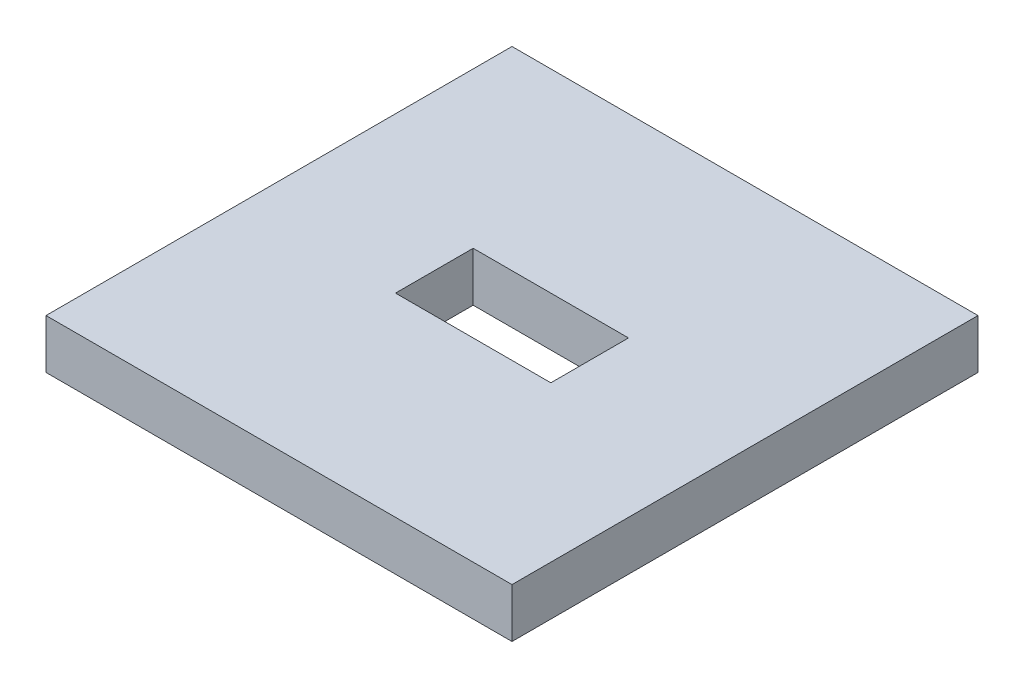
ISO-10303-21;
HEADER;
FILE_DESCRIPTION(('STEP AP214'),'2;1');
FILE_NAME('part.step','',(''),(''),'','','');
FILE_SCHEMA(('AUTOMOTIVE_DESIGN { 1 0 10303 214 1 1 1 1 }'));
ENDSEC;
DATA;
#1=APPLICATION_CONTEXT('core data for automotive mechanical design processes');
#2=APPLICATION_PROTOCOL_DEFINITION('international standard','automotive_design',2000,#1);
#3=PRODUCT_CONTEXT('',#1,'mechanical');
#4=PRODUCT('Part','Part','',(#3));
#5=PRODUCT_RELATED_PRODUCT_CATEGORY('part','',(#4));
#6=PRODUCT_DEFINITION_FORMATION('','',#4);
#7=PRODUCT_DEFINITION_CONTEXT('part definition',#1,'design');
#8=PRODUCT_DEFINITION('design','',#6,#7);
#9=PRODUCT_DEFINITION_SHAPE('','',#8);
#10=(LENGTH_UNIT() NAMED_UNIT(*) SI_UNIT(.MILLI.,.METRE.));
#11=(NAMED_UNIT(*) PLANE_ANGLE_UNIT() SI_UNIT($,.RADIAN.));
#12=(NAMED_UNIT(*) SI_UNIT($,.STERADIAN.) SOLID_ANGLE_UNIT());
#13=UNCERTAINTY_MEASURE_WITH_UNIT(LENGTH_MEASURE(1.E-05),#10,'distance_accuracy_value','');
#14=(GEOMETRIC_REPRESENTATION_CONTEXT(3) GLOBAL_UNCERTAINTY_ASSIGNED_CONTEXT((#13)) GLOBAL_UNIT_ASSIGNED_CONTEXT((#10,
#11,#12)) REPRESENTATION_CONTEXT('',''));
#15=CARTESIAN_POINT('',(0.,0.,0.));
#16=DIRECTION('',(0.,0.,1.));
#17=DIRECTION('',(1.,0.,0.));
#18=AXIS2_PLACEMENT_3D('',#15,#16,#17);
#19=CARTESIAN_POINT('',(0.,6.35,0.));
#20=DIRECTION('',(0.,-1.,0.));
#21=DIRECTION('',(0.,0.,-1.));
#22=AXIS2_PLACEMENT_3D('',#19,#20,#21);
#23=PLANE('',#22);
#24=DIRECTION('',(0.,0.,1.));
#25=VECTOR('',#24,1.);
#26=CARTESIAN_POINT('',(0.,6.35,0.));
#27=LINE('',#26,#25);
#28=CARTESIAN_POINT('',(0.,6.35,-60.));
#29=VERTEX_POINT('',#28);
#30=CARTESIAN_POINT('',(0.,6.35,0.));
#31=VERTEX_POINT('',#30);
#32=EDGE_CURVE('E153',#29,#31,#27,.T.);
#33=ORIENTED_EDGE('',*,*,#32,.T.);
#34=DIRECTION('',(1.,0.,0.));
#35=VECTOR('',#34,1.);
#36=CARTESIAN_POINT('',(0.,6.35,0.));
#37=LINE('',#36,#35);
#38=CARTESIAN_POINT('',(60.,6.35,0.));
#39=VERTEX_POINT('',#38);
#40=EDGE_CURVE('E157',#31,#39,#37,.T.);
#41=ORIENTED_EDGE('',*,*,#40,.T.);
#42=DIRECTION('',(0.,0.,-1.));
#43=VECTOR('',#42,1.);
#44=CARTESIAN_POINT('',(60.,6.35,0.));
#45=LINE('',#44,#43);
#46=CARTESIAN_POINT('',(60.,6.35,-60.));
#47=VERTEX_POINT('',#46);
#48=EDGE_CURVE('E161',#39,#47,#45,.T.);
#49=ORIENTED_EDGE('',*,*,#48,.T.);
#50=DIRECTION('',(-1.,0.,0.));
#51=VECTOR('',#50,1.);
#52=CARTESIAN_POINT('',(0.,6.35,-60.));
#53=LINE('',#52,#51);
#54=EDGE_CURVE('E164',#47,#29,#53,.T.);
#55=ORIENTED_EDGE('',*,*,#54,.T.);
#56=EDGE_LOOP('',(#33,#41,#49,#55));
#57=FACE_BOUND('',#56,.T.);
#58=DIRECTION('',(0.,0.,1.));
#59=VECTOR('',#58,1.);
#60=CARTESIAN_POINT('',(20.,6.35,-35.));
#61=LINE('',#60,#59);
#62=CARTESIAN_POINT('',(20.,6.35,-35.));
#63=VERTEX_POINT('',#62);
#64=CARTESIAN_POINT('',(20.,6.35,-25.));
#65=VERTEX_POINT('',#64);
#66=EDGE_CURVE('E105',#63,#65,#61,.T.);
#67=ORIENTED_EDGE('',*,*,#66,.F.);
#68=DIRECTION('',(-1.,0.,0.));
#69=VECTOR('',#68,1.);
#70=CARTESIAN_POINT('',(20.,6.35,-35.));
#71=LINE('',#70,#69);
#72=CARTESIAN_POINT('',(40.,6.35,-35.));
#73=VERTEX_POINT('',#72);
#74=EDGE_CURVE('E131',#73,#63,#71,.T.);
#75=ORIENTED_EDGE('',*,*,#74,.F.);
#76=DIRECTION('',(0.,0.,-1.));
#77=VECTOR('',#76,1.);
#78=CARTESIAN_POINT('',(40.,6.35,-35.));
#79=LINE('',#78,#77);
#80=CARTESIAN_POINT('',(40.,6.35,-25.));
#81=VERTEX_POINT('',#80);
#82=EDGE_CURVE('E127',#81,#73,#79,.T.);
#83=ORIENTED_EDGE('',*,*,#82,.F.);
#84=DIRECTION('',(1.,0.,0.));
#85=VECTOR('',#84,1.);
#86=CARTESIAN_POINT('',(20.,6.35,-25.));
#87=LINE('',#86,#85);
#88=EDGE_CURVE('E114',#65,#81,#87,.T.);
#89=ORIENTED_EDGE('',*,*,#88,.F.);
#90=EDGE_LOOP('',(#67,#75,#83,#89));
#91=FACE_BOUND('',#90,.T.);
#92=ADVANCED_FACE('F39',(#57,#91),#23,.F.);
#93=CARTESIAN_POINT('',(0.,0.,0.));
#94=DIRECTION('',(0.,-1.,0.));
#95=DIRECTION('',(0.,0.,-1.));
#96=AXIS2_PLACEMENT_3D('',#93,#94,#95);
#97=PLANE('',#96);
#98=DIRECTION('',(0.,0.,1.));
#99=VECTOR('',#98,1.);
#100=CARTESIAN_POINT('',(0.,0.,0.));
#101=LINE('',#100,#99);
#102=CARTESIAN_POINT('',(0.,0.,-60.));
#103=VERTEX_POINT('',#102);
#104=CARTESIAN_POINT('',(0.,0.,0.));
#105=VERTEX_POINT('',#104);
#106=EDGE_CURVE('E123',#103,#105,#101,.T.);
#107=ORIENTED_EDGE('',*,*,#106,.F.);
#108=DIRECTION('',(-1.,0.,0.));
#109=VECTOR('',#108,1.);
#110=CARTESIAN_POINT('',(0.,0.,-60.));
#111=LINE('',#110,#109);
#112=CARTESIAN_POINT('',(60.,0.,-60.));
#113=VERTEX_POINT('',#112);
#114=EDGE_CURVE('E158',#113,#103,#111,.T.);
#115=ORIENTED_EDGE('',*,*,#114,.F.);
#116=DIRECTION('',(0.,0.,-1.));
#117=VECTOR('',#116,1.);
#118=CARTESIAN_POINT('',(60.,0.,0.));
#119=LINE('',#118,#117);
#120=CARTESIAN_POINT('',(60.,0.,0.));
#121=VERTEX_POINT('',#120);
#122=EDGE_CURVE('E174',#121,#113,#119,.T.);
#123=ORIENTED_EDGE('',*,*,#122,.F.);
#124=DIRECTION('',(1.,0.,0.));
#125=VECTOR('',#124,1.);
#126=CARTESIAN_POINT('',(0.,0.,0.));
#127=LINE('',#126,#125);
#128=EDGE_CURVE('E171',#105,#121,#127,.T.);
#129=ORIENTED_EDGE('',*,*,#128,.F.);
#130=EDGE_LOOP('',(#107,#115,#123,#129));
#131=FACE_BOUND('',#130,.T.);
#132=DIRECTION('',(-1.,0.,0.));
#133=VECTOR('',#132,1.);
#134=CARTESIAN_POINT('',(20.,0.,-35.));
#135=LINE('',#134,#133);
#136=CARTESIAN_POINT('',(40.,0.,-35.));
#137=VERTEX_POINT('',#136);
#138=CARTESIAN_POINT('',(20.,0.,-35.));
#139=VERTEX_POINT('',#138);
#140=EDGE_CURVE('E115',#137,#139,#135,.T.);
#141=ORIENTED_EDGE('',*,*,#140,.T.);
#142=DIRECTION('',(0.,0.,1.));
#143=VECTOR('',#142,1.);
#144=CARTESIAN_POINT('',(20.,0.,-35.));
#145=LINE('',#144,#143);
#146=CARTESIAN_POINT('',(20.,0.,-25.));
#147=VERTEX_POINT('',#146);
#148=EDGE_CURVE('E63',#139,#147,#145,.T.);
#149=ORIENTED_EDGE('',*,*,#148,.T.);
#150=DIRECTION('',(1.,0.,0.));
#151=VECTOR('',#150,1.);
#152=CARTESIAN_POINT('',(20.,0.,-25.));
#153=LINE('',#152,#151);
#154=CARTESIAN_POINT('',(40.,0.,-25.));
#155=VERTEX_POINT('',#154);
#156=EDGE_CURVE('E121',#147,#155,#153,.T.);
#157=ORIENTED_EDGE('',*,*,#156,.T.);
#158=DIRECTION('',(0.,0.,-1.));
#159=VECTOR('',#158,1.);
#160=CARTESIAN_POINT('',(40.,0.,-35.));
#161=LINE('',#160,#159);
#162=EDGE_CURVE('E140',#155,#137,#161,.T.);
#163=ORIENTED_EDGE('',*,*,#162,.T.);
#164=EDGE_LOOP('',(#141,#149,#157,#163));
#165=FACE_BOUND('',#164,.T.);
#166=ADVANCED_FACE('F197',(#131,#165),#97,.T.);
#167=CARTESIAN_POINT('',(0.,6.35,0.));
#168=DIRECTION('',(1.,0.,0.));
#169=DIRECTION('',(0.,0.,-1.));
#170=AXIS2_PLACEMENT_3D('',#167,#168,#169);
#171=PLANE('',#170);
#172=ORIENTED_EDGE('',*,*,#106,.T.);
#173=DIRECTION('',(0.,-1.,0.));
#174=VECTOR('',#173,1.);
#175=CARTESIAN_POINT('',(0.,6.35,0.));
#176=LINE('',#175,#174);
#177=EDGE_CURVE('E11',#31,#105,#176,.T.);
#178=ORIENTED_EDGE('',*,*,#177,.F.);
#179=ORIENTED_EDGE('',*,*,#32,.F.);
#180=DIRECTION('',(0.,-1.,0.));
#181=VECTOR('',#180,1.);
#182=CARTESIAN_POINT('',(0.,6.35,-60.));
#183=LINE('',#182,#181);
#184=EDGE_CURVE('E167',#29,#103,#183,.T.);
#185=ORIENTED_EDGE('',*,*,#184,.T.);
#186=EDGE_LOOP('',(#172,#178,#179,#185));
#187=FACE_BOUND('',#186,.T.);
#188=ADVANCED_FACE('F41',(#187),#171,.F.);
#189=CARTESIAN_POINT('',(0.,6.35,0.));
#190=DIRECTION('',(0.,0.,-1.));
#191=DIRECTION('',(-1.,0.,0.));
#192=AXIS2_PLACEMENT_3D('',#189,#190,#191);
#193=PLANE('',#192);
#194=ORIENTED_EDGE('',*,*,#128,.T.);
#195=DIRECTION('',(0.,-1.,0.));
#196=VECTOR('',#195,1.);
#197=CARTESIAN_POINT('',(60.,6.35,0.));
#198=LINE('',#197,#196);
#199=EDGE_CURVE('E48',#39,#121,#198,.T.);
#200=ORIENTED_EDGE('',*,*,#199,.F.);
#201=ORIENTED_EDGE('',*,*,#40,.F.);
#202=ORIENTED_EDGE('',*,*,#177,.T.);
#203=EDGE_LOOP('',(#194,#200,#201,#202));
#204=FACE_BOUND('',#203,.T.);
#205=ADVANCED_FACE('F207',(#204),#193,.F.);
#206=CARTESIAN_POINT('',(60.,6.35,0.));
#207=DIRECTION('',(-1.,0.,0.));
#208=DIRECTION('',(0.,0.,1.));
#209=AXIS2_PLACEMENT_3D('',#206,#207,#208);
#210=PLANE('',#209);
#211=ORIENTED_EDGE('',*,*,#122,.T.);
#212=DIRECTION('',(0.,-1.,0.));
#213=VECTOR('',#212,1.);
#214=CARTESIAN_POINT('',(60.,6.35,-60.));
#215=LINE('',#214,#213);
#216=EDGE_CURVE('E182',#47,#113,#215,.T.);
#217=ORIENTED_EDGE('',*,*,#216,.F.);
#218=ORIENTED_EDGE('',*,*,#48,.F.);
#219=ORIENTED_EDGE('',*,*,#199,.T.);
#220=EDGE_LOOP('',(#211,#217,#218,#219));
#221=FACE_BOUND('',#220,.T.);
#222=ADVANCED_FACE('F191',(#221),#210,.F.);
#223=CARTESIAN_POINT('',(0.,6.35,-60.));
#224=DIRECTION('',(0.,0.,1.));
#225=DIRECTION('',(1.,0.,0.));
#226=AXIS2_PLACEMENT_3D('',#223,#224,#225);
#227=PLANE('',#226);
#228=ORIENTED_EDGE('',*,*,#114,.T.);
#229=ORIENTED_EDGE('',*,*,#184,.F.);
#230=ORIENTED_EDGE('',*,*,#54,.F.);
#231=ORIENTED_EDGE('',*,*,#216,.T.);
#232=EDGE_LOOP('',(#228,#229,#230,#231));
#233=FACE_BOUND('',#232,.T.);
#234=ADVANCED_FACE('F201',(#233),#227,.F.);
#235=CARTESIAN_POINT('',(20.,6.35,-35.));
#236=DIRECTION('',(1.,0.,0.));
#237=DIRECTION('',(0.,0.,-1.));
#238=AXIS2_PLACEMENT_3D('',#235,#236,#237);
#239=PLANE('',#238);
#240=ORIENTED_EDGE('',*,*,#148,.F.);
#241=DIRECTION('',(0.,-1.,0.));
#242=VECTOR('',#241,1.);
#243=CARTESIAN_POINT('',(20.,6.35,-35.));
#244=LINE('',#243,#242);
#245=EDGE_CURVE('E109',#63,#139,#244,.T.);
#246=ORIENTED_EDGE('',*,*,#245,.F.);
#247=ORIENTED_EDGE('',*,*,#66,.T.);
#248=DIRECTION('',(0.,-1.,0.));
#249=VECTOR('',#248,1.);
#250=CARTESIAN_POINT('',(20.,6.35,-25.));
#251=LINE('',#250,#249);
#252=EDGE_CURVE('E108',#65,#147,#251,.T.);
#253=ORIENTED_EDGE('',*,*,#252,.T.);
#254=EDGE_LOOP('',(#240,#246,#247,#253));
#255=FACE_BOUND('',#254,.T.);
#256=ADVANCED_FACE('F107',(#255),#239,.T.);
#257=CARTESIAN_POINT('',(20.,6.35,-25.));
#258=DIRECTION('',(0.,0.,-1.));
#259=DIRECTION('',(-1.,0.,0.));
#260=AXIS2_PLACEMENT_3D('',#257,#258,#259);
#261=PLANE('',#260);
#262=ORIENTED_EDGE('',*,*,#156,.F.);
#263=ORIENTED_EDGE('',*,*,#252,.F.);
#264=ORIENTED_EDGE('',*,*,#88,.T.);
#265=DIRECTION('',(0.,-1.,0.));
#266=VECTOR('',#265,1.);
#267=CARTESIAN_POINT('',(40.,6.35,-25.));
#268=LINE('',#267,#266);
#269=EDGE_CURVE('E124',#81,#155,#268,.T.);
#270=ORIENTED_EDGE('',*,*,#269,.T.);
#271=EDGE_LOOP('',(#262,#263,#264,#270));
#272=FACE_BOUND('',#271,.T.);
#273=ADVANCED_FACE('F118',(#272),#261,.T.);
#274=CARTESIAN_POINT('',(40.,6.35,-35.));
#275=DIRECTION('',(-1.,0.,0.));
#276=DIRECTION('',(0.,0.,1.));
#277=AXIS2_PLACEMENT_3D('',#274,#275,#276);
#278=PLANE('',#277);
#279=ORIENTED_EDGE('',*,*,#162,.F.);
#280=ORIENTED_EDGE('',*,*,#269,.F.);
#281=ORIENTED_EDGE('',*,*,#82,.T.);
#282=DIRECTION('',(0.,-1.,0.));
#283=VECTOR('',#282,1.);
#284=CARTESIAN_POINT('',(40.,6.35,-35.));
#285=LINE('',#284,#283);
#286=EDGE_CURVE('E55',#73,#137,#285,.T.);
#287=ORIENTED_EDGE('',*,*,#286,.T.);
#288=EDGE_LOOP('',(#279,#280,#281,#287));
#289=FACE_BOUND('',#288,.T.);
#290=ADVANCED_FACE('F230',(#289),#278,.T.);
#291=CARTESIAN_POINT('',(20.,6.35,-35.));
#292=DIRECTION('',(0.,0.,1.));
#293=DIRECTION('',(1.,0.,0.));
#294=AXIS2_PLACEMENT_3D('',#291,#292,#293);
#295=PLANE('',#294);
#296=ORIENTED_EDGE('',*,*,#140,.F.);
#297=ORIENTED_EDGE('',*,*,#286,.F.);
#298=ORIENTED_EDGE('',*,*,#74,.T.);
#299=ORIENTED_EDGE('',*,*,#245,.T.);
#300=EDGE_LOOP('',(#296,#297,#298,#299));
#301=FACE_BOUND('',#300,.T.);
#302=ADVANCED_FACE('F234',(#301),#295,.T.);
#303=CLOSED_SHELL('',(#92,#166,#188,#205,#222,#234,#256,#273,#290,#302));
#304=MANIFOLD_SOLID_BREP('B2',#303);
#305=ADVANCED_BREP_SHAPE_REPRESENTATION('',(#18,#304),#14);
#306=SHAPE_DEFINITION_REPRESENTATION(#9,#305);
ENDSEC;
END-ISO-10303-21;
